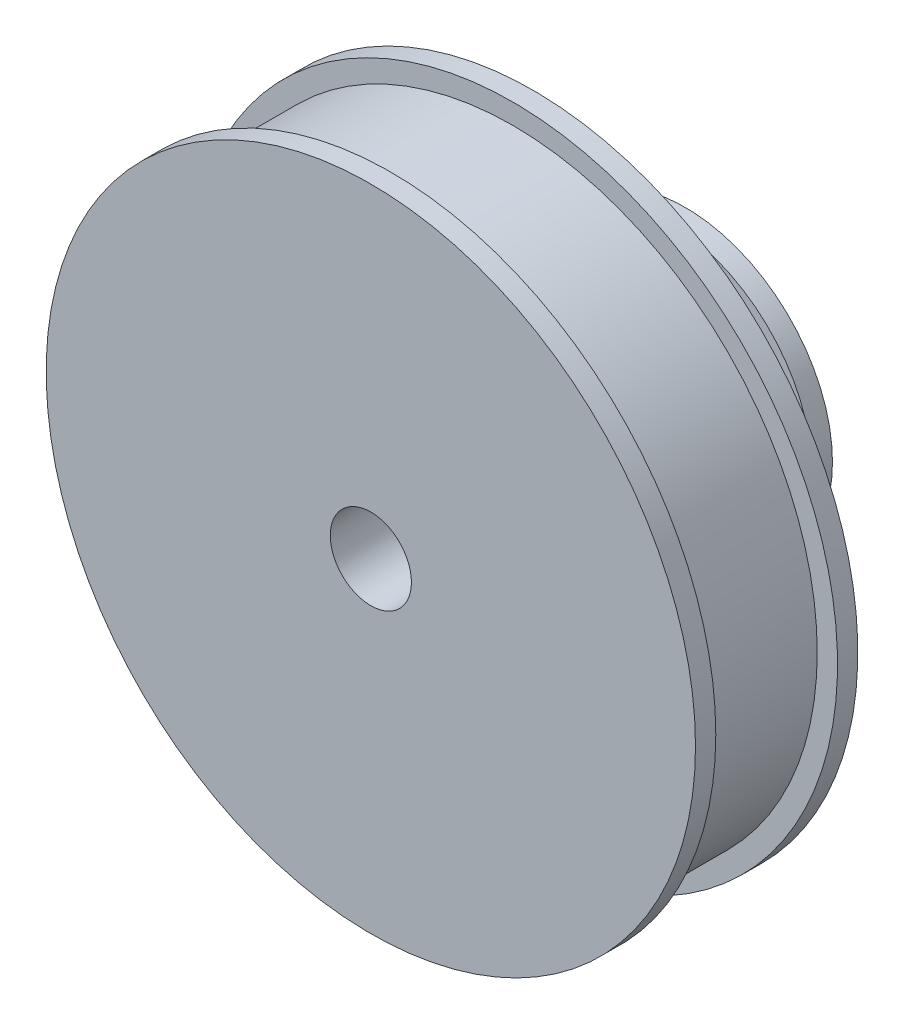
ISO-10303-21;
HEADER;
FILE_DESCRIPTION(('STEP AP214'),'2;1');
FILE_NAME('part.step','',(''),(''),'','','');
FILE_SCHEMA(('AUTOMOTIVE_DESIGN { 1 0 10303 214 1 1 1 1 }'));
ENDSEC;
DATA;
#1=APPLICATION_CONTEXT('core data for automotive mechanical design processes');
#2=APPLICATION_PROTOCOL_DEFINITION('international standard','automotive_design',2000,#1);
#3=PRODUCT_CONTEXT('',#1,'mechanical');
#4=PRODUCT('Part','Part','',(#3));
#5=PRODUCT_RELATED_PRODUCT_CATEGORY('part','',(#4));
#6=PRODUCT_DEFINITION_FORMATION('','',#4);
#7=PRODUCT_DEFINITION_CONTEXT('part definition',#1,'design');
#8=PRODUCT_DEFINITION('design','',#6,#7);
#9=PRODUCT_DEFINITION_SHAPE('','',#8);
#10=(LENGTH_UNIT() NAMED_UNIT(*) SI_UNIT(.MILLI.,.METRE.));
#11=(NAMED_UNIT(*) PLANE_ANGLE_UNIT() SI_UNIT($,.RADIAN.));
#12=(NAMED_UNIT(*) SI_UNIT($,.STERADIAN.) SOLID_ANGLE_UNIT());
#13=UNCERTAINTY_MEASURE_WITH_UNIT(LENGTH_MEASURE(1.E-05),#10,'distance_accuracy_value','');
#14=(GEOMETRIC_REPRESENTATION_CONTEXT(3) GLOBAL_UNCERTAINTY_ASSIGNED_CONTEXT((#13)) GLOBAL_UNIT_ASSIGNED_CONTEXT((#10,
#11,#12)) REPRESENTATION_CONTEXT('',''));
#15=CARTESIAN_POINT('',(0.,0.,0.));
#16=DIRECTION('',(0.,0.,1.));
#17=DIRECTION('',(1.,0.,0.));
#18=AXIS2_PLACEMENT_3D('',#15,#16,#17);
#19=CARTESIAN_POINT('',(0.,0.,29.));
#20=DIRECTION('',(0.,0.,-1.));
#21=DIRECTION('',(-1.,0.,0.));
#22=AXIS2_PLACEMENT_3D('',#19,#20,#21);
#23=CYLINDRICAL_SURFACE('',#22,30.);
#24=CARTESIAN_POINT('',(0.,0.,15.));
#25=DIRECTION('',(0.,0.,-1.));
#26=DIRECTION('',(-1.,0.,0.));
#27=AXIS2_PLACEMENT_3D('',#24,#25,#26);
#28=CIRCLE('',#27,30.);
#29=CARTESIAN_POINT('',(-30.,0.,15.));
#30=VERTEX_POINT('',#29);
#31=EDGE_CURVE('E45',#30,#30,#28,.T.);
#32=ORIENTED_EDGE('',*,*,#31,.F.);
#33=EDGE_LOOP('',(#32));
#34=FACE_BOUND('',#33,.T.);
#35=CARTESIAN_POINT('',(0.,0.,27.));
#36=DIRECTION('',(0.,0.,1.));
#37=DIRECTION('',(1.,0.,0.));
#38=AXIS2_PLACEMENT_3D('',#35,#36,#37);
#39=CIRCLE('',#38,30.);
#40=CARTESIAN_POINT('',(30.,0.,27.));
#41=VERTEX_POINT('',#40);
#42=EDGE_CURVE('E10',#41,#41,#39,.T.);
#43=ORIENTED_EDGE('',*,*,#42,.F.);
#44=EDGE_LOOP('',(#43));
#45=FACE_BOUND('',#44,.T.);
#46=ADVANCED_FACE('F28',(#34,#45),#23,.T.);
#47=CARTESIAN_POINT('',(0.,0.,27.));
#48=DIRECTION('',(0.,0.,1.));
#49=DIRECTION('',(1.,0.,0.));
#50=AXIS2_PLACEMENT_3D('',#47,#48,#49);
#51=PLANE('',#50);
#52=CARTESIAN_POINT('',(0.,0.,27.));
#53=DIRECTION('',(0.,0.,1.));
#54=DIRECTION('',(1.,0.,0.));
#55=AXIS2_PLACEMENT_3D('',#52,#53,#54);
#56=CIRCLE('',#55,32.);
#57=CARTESIAN_POINT('',(32.,0.,27.));
#58=VERTEX_POINT('',#57);
#59=EDGE_CURVE('E36',#58,#58,#56,.T.);
#60=ORIENTED_EDGE('',*,*,#59,.F.);
#61=EDGE_LOOP('',(#60));
#62=FACE_BOUND('',#61,.T.);
#63=ORIENTED_EDGE('',*,*,#42,.T.);
#64=EDGE_LOOP('',(#63));
#65=FACE_BOUND('',#64,.T.);
#66=ADVANCED_FACE('F81',(#62,#65),#51,.F.);
#67=CARTESIAN_POINT('',(0.,0.,27.));
#68=DIRECTION('',(0.,0.,1.));
#69=DIRECTION('',(1.,0.,0.));
#70=AXIS2_PLACEMENT_3D('',#67,#68,#69);
#71=CYLINDRICAL_SURFACE('',#70,32.);
#72=ORIENTED_EDGE('',*,*,#59,.T.);
#73=EDGE_LOOP('',(#72));
#74=FACE_BOUND('',#73,.T.);
#75=CARTESIAN_POINT('',(0.,0.,29.));
#76=DIRECTION('',(0.,0.,1.));
#77=DIRECTION('',(1.,0.,0.));
#78=AXIS2_PLACEMENT_3D('',#75,#76,#77);
#79=CIRCLE('',#78,32.);
#80=CARTESIAN_POINT('',(32.,0.,29.));
#81=VERTEX_POINT('',#80);
#82=EDGE_CURVE('E40',#81,#81,#79,.T.);
#83=ORIENTED_EDGE('',*,*,#82,.F.);
#84=EDGE_LOOP('',(#83));
#85=FACE_BOUND('',#84,.T.);
#86=ADVANCED_FACE('F76',(#74,#85),#71,.T.);
#87=CARTESIAN_POINT('',(0.,0.,29.));
#88=DIRECTION('',(0.,0.,1.));
#89=DIRECTION('',(1.,0.,0.));
#90=AXIS2_PLACEMENT_3D('',#87,#88,#89);
#91=PLANE('',#90);
#92=CARTESIAN_POINT('',(0.,0.,29.));
#93=DIRECTION('',(0.,0.,1.));
#94=DIRECTION('',(1.,0.,0.));
#95=AXIS2_PLACEMENT_3D('',#92,#93,#94);
#96=CIRCLE('',#95,4.);
#97=CARTESIAN_POINT('',(4.,0.,29.));
#98=VERTEX_POINT('',#97);
#99=EDGE_CURVE('E66',#98,#98,#96,.T.);
#100=ORIENTED_EDGE('',*,*,#99,.F.);
#101=EDGE_LOOP('',(#100));
#102=FACE_BOUND('',#101,.T.);
#103=ORIENTED_EDGE('',*,*,#82,.T.);
#104=EDGE_LOOP('',(#103));
#105=FACE_BOUND('',#104,.T.);
#106=ADVANCED_FACE('F72',(#102,#105),#91,.T.);
#107=CARTESIAN_POINT('',(0.,0.,13.));
#108=DIRECTION('',(0.,0.,-1.));
#109=DIRECTION('',(-1.,0.,0.));
#110=AXIS2_PLACEMENT_3D('',#107,#108,#109);
#111=PLANE('',#110);
#112=CARTESIAN_POINT('',(0.,0.,13.));
#113=DIRECTION('',(0.,0.,-1.));
#114=DIRECTION('',(-1.,0.,0.));
#115=AXIS2_PLACEMENT_3D('',#112,#113,#114);
#116=CIRCLE('',#115,32.);
#117=CARTESIAN_POINT('',(-32.,0.,13.));
#118=VERTEX_POINT('',#117);
#119=EDGE_CURVE('E48',#118,#118,#116,.T.);
#120=ORIENTED_EDGE('',*,*,#119,.T.);
#121=EDGE_LOOP('',(#120));
#122=FACE_BOUND('',#121,.T.);
#123=CARTESIAN_POINT('',(0.,0.,13.));
#124=DIRECTION('',(0.,0.,-1.));
#125=DIRECTION('',(-1.,0.,0.));
#126=AXIS2_PLACEMENT_3D('',#123,#124,#125);
#127=CIRCLE('',#126,12.5);
#128=CARTESIAN_POINT('',(-12.5,0.,13.));
#129=VERTEX_POINT('',#128);
#130=EDGE_CURVE('E32',#129,#129,#127,.T.);
#131=ORIENTED_EDGE('',*,*,#130,.F.);
#132=EDGE_LOOP('',(#131));
#133=FACE_BOUND('',#132,.T.);
#134=ADVANCED_FACE('F75',(#122,#133),#111,.T.);
#135=CARTESIAN_POINT('',(0.,0.,15.));
#136=DIRECTION('',(0.,0.,-1.));
#137=DIRECTION('',(-1.,0.,0.));
#138=AXIS2_PLACEMENT_3D('',#135,#136,#137);
#139=PLANE('',#138);
#140=CARTESIAN_POINT('',(0.,0.,15.));
#141=DIRECTION('',(0.,0.,-1.));
#142=DIRECTION('',(-1.,0.,0.));
#143=AXIS2_PLACEMENT_3D('',#140,#141,#142);
#144=CIRCLE('',#143,32.);
#145=CARTESIAN_POINT('',(-32.,0.,15.));
#146=VERTEX_POINT('',#145);
#147=EDGE_CURVE('E51',#146,#146,#144,.T.);
#148=ORIENTED_EDGE('',*,*,#147,.F.);
#149=EDGE_LOOP('',(#148));
#150=FACE_BOUND('',#149,.T.);
#151=ORIENTED_EDGE('',*,*,#31,.T.);
#152=EDGE_LOOP('',(#151));
#153=FACE_BOUND('',#152,.T.);
#154=ADVANCED_FACE('F96',(#150,#153),#139,.F.);
#155=CARTESIAN_POINT('',(0.,0.,13.));
#156=DIRECTION('',(0.,0.,1.));
#157=DIRECTION('',(1.,0.,0.));
#158=AXIS2_PLACEMENT_3D('',#155,#156,#157);
#159=CYLINDRICAL_SURFACE('',#158,32.);
#160=ORIENTED_EDGE('',*,*,#119,.F.);
#161=EDGE_LOOP('',(#160));
#162=FACE_BOUND('',#161,.T.);
#163=ORIENTED_EDGE('',*,*,#147,.T.);
#164=EDGE_LOOP('',(#163));
#165=FACE_BOUND('',#164,.T.);
#166=ADVANCED_FACE('F98',(#162,#165),#159,.T.);
#167=CARTESIAN_POINT('',(0.,0.,15.));
#168=DIRECTION('',(0.,0.,-1.));
#169=DIRECTION('',(-1.,0.,0.));
#170=AXIS2_PLACEMENT_3D('',#167,#168,#169);
#171=CYLINDRICAL_SURFACE('',#170,12.5);
#172=ORIENTED_EDGE('',*,*,#130,.T.);
#173=EDGE_LOOP('',(#172));
#174=FACE_BOUND('',#173,.T.);
#175=CARTESIAN_POINT('',(0.,0.,0.));
#176=DIRECTION('',(0.,0.,-1.));
#177=DIRECTION('',(-1.,0.,0.));
#178=AXIS2_PLACEMENT_3D('',#175,#176,#177);
#179=CIRCLE('',#178,12.5);
#180=CARTESIAN_POINT('',(-12.5,0.,0.));
#181=VERTEX_POINT('',#180);
#182=EDGE_CURVE('E54',#181,#181,#179,.T.);
#183=ORIENTED_EDGE('',*,*,#182,.F.);
#184=EDGE_LOOP('',(#183));
#185=FACE_BOUND('',#184,.T.);
#186=ADVANCED_FACE('F30',(#174,#185),#171,.T.);
#187=CARTESIAN_POINT('',(0.,0.,0.));
#188=DIRECTION('',(0.,0.,-1.));
#189=DIRECTION('',(-1.,0.,0.));
#190=AXIS2_PLACEMENT_3D('',#187,#188,#189);
#191=PLANE('',#190);
#192=CARTESIAN_POINT('',(0.,0.,0.));
#193=DIRECTION('',(0.,0.,-1.));
#194=DIRECTION('',(-1.,0.,0.));
#195=AXIS2_PLACEMENT_3D('',#192,#193,#194);
#196=CIRCLE('',#195,14.5);
#197=CARTESIAN_POINT('',(-14.5,0.,0.));
#198=VERTEX_POINT('',#197);
#199=EDGE_CURVE('E60',#198,#198,#196,.T.);
#200=ORIENTED_EDGE('',*,*,#199,.F.);
#201=EDGE_LOOP('',(#200));
#202=FACE_BOUND('',#201,.T.);
#203=ORIENTED_EDGE('',*,*,#182,.T.);
#204=EDGE_LOOP('',(#203));
#205=FACE_BOUND('',#204,.T.);
#206=ADVANCED_FACE('F115',(#202,#205),#191,.F.);
#207=CARTESIAN_POINT('',(0.,0.,-2.));
#208=DIRECTION('',(0.,0.,1.));
#209=DIRECTION('',(1.,0.,0.));
#210=AXIS2_PLACEMENT_3D('',#207,#208,#209);
#211=CYLINDRICAL_SURFACE('',#210,14.5);
#212=CARTESIAN_POINT('',(0.,0.,-2.));
#213=DIRECTION('',(0.,0.,-1.));
#214=DIRECTION('',(-1.,0.,0.));
#215=AXIS2_PLACEMENT_3D('',#212,#213,#214);
#216=CIRCLE('',#215,14.5);
#217=CARTESIAN_POINT('',(-14.5,0.,-2.));
#218=VERTEX_POINT('',#217);
#219=EDGE_CURVE('E57',#218,#218,#216,.T.);
#220=ORIENTED_EDGE('',*,*,#219,.F.);
#221=EDGE_LOOP('',(#220));
#222=FACE_BOUND('',#221,.T.);
#223=ORIENTED_EDGE('',*,*,#199,.T.);
#224=EDGE_LOOP('',(#223));
#225=FACE_BOUND('',#224,.T.);
#226=ADVANCED_FACE('F111',(#222,#225),#211,.T.);
#227=CARTESIAN_POINT('',(0.,0.,-2.));
#228=DIRECTION('',(0.,0.,-1.));
#229=DIRECTION('',(-1.,0.,0.));
#230=AXIS2_PLACEMENT_3D('',#227,#228,#229);
#231=PLANE('',#230);
#232=CARTESIAN_POINT('',(0.,0.,-2.));
#233=DIRECTION('',(0.,0.,1.));
#234=DIRECTION('',(1.,0.,0.));
#235=AXIS2_PLACEMENT_3D('',#232,#233,#234);
#236=CIRCLE('',#235,4.);
#237=CARTESIAN_POINT('',(4.,0.,-2.));
#238=VERTEX_POINT('',#237);
#239=EDGE_CURVE('E63',#238,#238,#236,.T.);
#240=ORIENTED_EDGE('',*,*,#239,.T.);
#241=EDGE_LOOP('',(#240));
#242=FACE_BOUND('',#241,.T.);
#243=ORIENTED_EDGE('',*,*,#219,.T.);
#244=EDGE_LOOP('',(#243));
#245=FACE_BOUND('',#244,.T.);
#246=ADVANCED_FACE('F114',(#242,#245),#231,.T.);
#247=CARTESIAN_POINT('',(0.,0.,-2.));
#248=DIRECTION('',(0.,0.,1.));
#249=DIRECTION('',(1.,0.,0.));
#250=AXIS2_PLACEMENT_3D('',#247,#248,#249);
#251=CYLINDRICAL_SURFACE('',#250,4.);
#252=ORIENTED_EDGE('',*,*,#239,.F.);
#253=EDGE_LOOP('',(#252));
#254=FACE_BOUND('',#253,.T.);
#255=ORIENTED_EDGE('',*,*,#99,.T.);
#256=EDGE_LOOP('',(#255));
#257=FACE_BOUND('',#256,.T.);
#258=ADVANCED_FACE('F70',(#254,#257),#251,.F.);
#259=CLOSED_SHELL('',(#46,#66,#86,#106,#134,#154,#166,#186,#206,#226,#246,#258));
#260=MANIFOLD_SOLID_BREP('B2',#259);
#261=ADVANCED_BREP_SHAPE_REPRESENTATION('',(#18,#260),#14);
#262=SHAPE_DEFINITION_REPRESENTATION(#9,#261);
ENDSEC;
END-ISO-10303-21;
